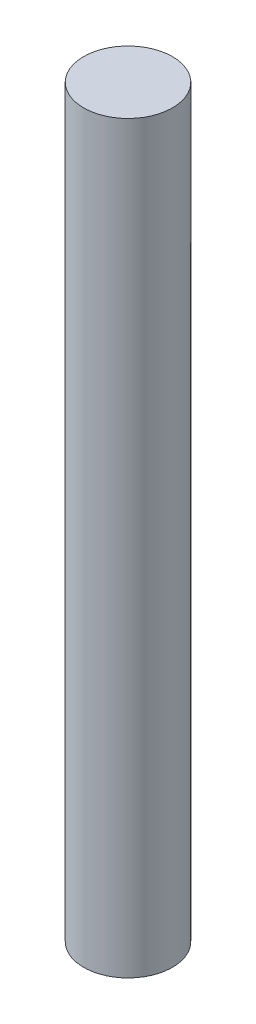
ISO-10303-21;
HEADER;
FILE_DESCRIPTION(('STEP AP214'),'2;1');
FILE_NAME('part.step','',(''),(''),'','','');
FILE_SCHEMA(('AUTOMOTIVE_DESIGN { 1 0 10303 214 1 1 1 1 }'));
ENDSEC;
DATA;
#1=APPLICATION_CONTEXT('core data for automotive mechanical design processes');
#2=APPLICATION_PROTOCOL_DEFINITION('international standard','automotive_design',2000,#1);
#3=PRODUCT_CONTEXT('',#1,'mechanical');
#4=PRODUCT('Part','Part','',(#3));
#5=PRODUCT_RELATED_PRODUCT_CATEGORY('part','',(#4));
#6=PRODUCT_DEFINITION_FORMATION('','',#4);
#7=PRODUCT_DEFINITION_CONTEXT('part definition',#1,'design');
#8=PRODUCT_DEFINITION('design','',#6,#7);
#9=PRODUCT_DEFINITION_SHAPE('','',#8);
#10=(LENGTH_UNIT() NAMED_UNIT(*) SI_UNIT(.MILLI.,.METRE.));
#11=(NAMED_UNIT(*) PLANE_ANGLE_UNIT() SI_UNIT($,.RADIAN.));
#12=(NAMED_UNIT(*) SI_UNIT($,.STERADIAN.) SOLID_ANGLE_UNIT());
#13=UNCERTAINTY_MEASURE_WITH_UNIT(LENGTH_MEASURE(1.E-05),#10,'distance_accuracy_value','');
#14=(GEOMETRIC_REPRESENTATION_CONTEXT(3) GLOBAL_UNCERTAINTY_ASSIGNED_CONTEXT((#13)) GLOBAL_UNIT_ASSIGNED_CONTEXT((#10,
#11,#12)) REPRESENTATION_CONTEXT('',''));
#15=CARTESIAN_POINT('',(0.,0.,0.));
#16=DIRECTION('',(0.,0.,1.));
#17=DIRECTION('',(1.,0.,0.));
#18=AXIS2_PLACEMENT_3D('',#15,#16,#17);
#19=CARTESIAN_POINT('',(0.,15.4210694278927,0.));
#20=DIRECTION('',(0.,1.,0.));
#21=DIRECTION('',(0.,0.,1.));
#22=AXIS2_PLACEMENT_3D('',#19,#20,#21);
#23=PLANE('',#22);
#24=CARTESIAN_POINT('',(0.,15.4210694278927,0.));
#25=DIRECTION('',(0.,-1.,0.));
#26=DIRECTION('',(0.,0.,-1.));
#27=AXIS2_PLACEMENT_3D('',#24,#25,#26);
#28=CIRCLE('',#27,2.5);
#29=CARTESIAN_POINT('',(0.,15.4210694278927,-2.5));
#30=VERTEX_POINT('',#29);
#31=EDGE_CURVE('E10',#30,#30,#28,.T.);
#32=ORIENTED_EDGE('',*,*,#31,.F.);
#33=EDGE_LOOP('',(#32));
#34=FACE_BOUND('',#33,.T.);
#35=ADVANCED_FACE('F37',(#34),#23,.T.);
#36=CARTESIAN_POINT('',(0.,-26.4789305721073,0.));
#37=DIRECTION('',(0.,-1.,0.));
#38=DIRECTION('',(0.,0.,-1.));
#39=AXIS2_PLACEMENT_3D('',#36,#37,#38);
#40=CYLINDRICAL_SURFACE('',#39,2.5);
#41=ORIENTED_EDGE('',*,*,#31,.T.);
#42=EDGE_LOOP('',(#41));
#43=FACE_BOUND('',#42,.T.);
#44=CARTESIAN_POINT('',(0.,-26.4789305721073,0.));
#45=DIRECTION('',(0.,-1.,0.));
#46=DIRECTION('',(0.,0.,-1.));
#47=AXIS2_PLACEMENT_3D('',#44,#45,#46);
#48=CIRCLE('',#47,2.5);
#49=CARTESIAN_POINT('',(0.,-26.4789305721073,-2.5));
#50=VERTEX_POINT('',#49);
#51=EDGE_CURVE('E43',#50,#50,#48,.T.);
#52=ORIENTED_EDGE('',*,*,#51,.F.);
#53=EDGE_LOOP('',(#52));
#54=FACE_BOUND('',#53,.T.);
#55=ADVANCED_FACE('F51',(#43,#54),#40,.T.);
#56=CARTESIAN_POINT('',(0.,-26.4789305721073,0.));
#57=DIRECTION('',(0.,-1.,0.));
#58=DIRECTION('',(0.,0.,-1.));
#59=AXIS2_PLACEMENT_3D('',#56,#57,#58);
#60=PLANE('',#59);
#61=ORIENTED_EDGE('',*,*,#51,.T.);
#62=EDGE_LOOP('',(#61));
#63=FACE_BOUND('',#62,.T.);
#64=ADVANCED_FACE('F49',(#63),#60,.T.);
#65=CLOSED_SHELL('',(#35,#55,#64));
#66=MANIFOLD_SOLID_BREP('B2',#65);
#67=ADVANCED_BREP_SHAPE_REPRESENTATION('',(#18,#66),#14);
#68=SHAPE_DEFINITION_REPRESENTATION(#9,#67);
ENDSEC;
END-ISO-10303-21;
